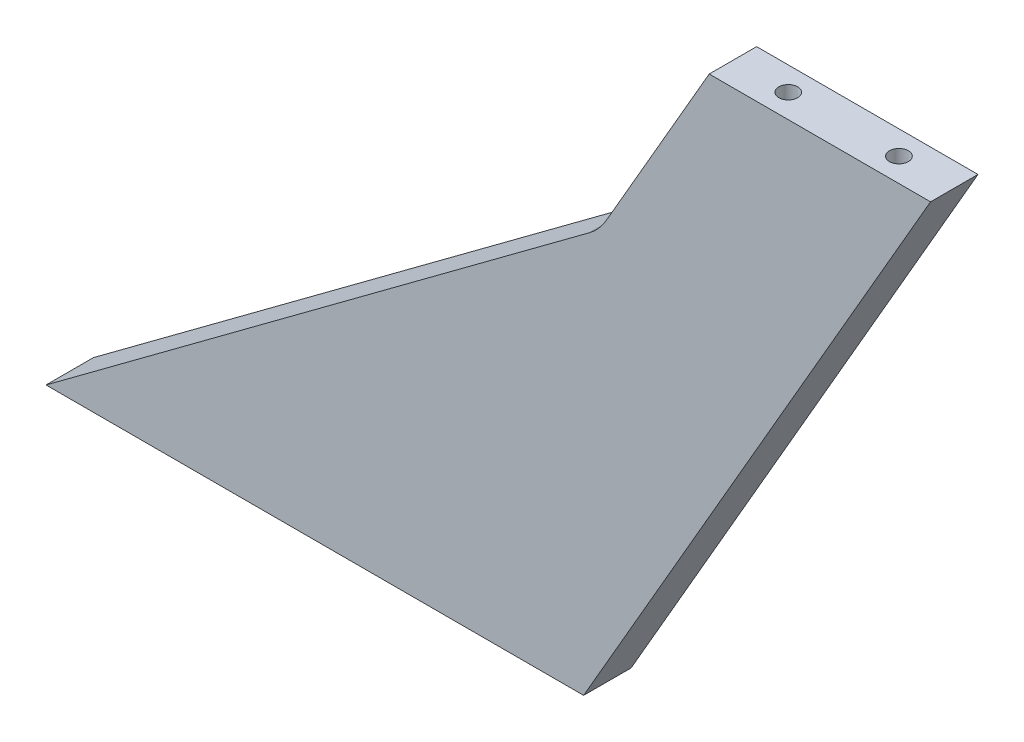
ISO-10303-21;
HEADER;
FILE_DESCRIPTION(('STEP AP214'),'2;1');
FILE_NAME('part.step','',(''),(''),'','','');
FILE_SCHEMA(('AUTOMOTIVE_DESIGN { 1 0 10303 214 1 1 1 1 }'));
ENDSEC;
DATA;
#1=APPLICATION_CONTEXT('core data for automotive mechanical design processes');
#2=APPLICATION_PROTOCOL_DEFINITION('international standard','automotive_design',2000,#1);
#3=PRODUCT_CONTEXT('',#1,'mechanical');
#4=PRODUCT('Part','Part','',(#3));
#5=PRODUCT_RELATED_PRODUCT_CATEGORY('part','',(#4));
#6=PRODUCT_DEFINITION_FORMATION('','',#4);
#7=PRODUCT_DEFINITION_CONTEXT('part definition',#1,'design');
#8=PRODUCT_DEFINITION('design','',#6,#7);
#9=PRODUCT_DEFINITION_SHAPE('','',#8);
#10=(LENGTH_UNIT() NAMED_UNIT(*) SI_UNIT(.MILLI.,.METRE.));
#11=(NAMED_UNIT(*) PLANE_ANGLE_UNIT() SI_UNIT($,.RADIAN.));
#12=(NAMED_UNIT(*) SI_UNIT($,.STERADIAN.) SOLID_ANGLE_UNIT());
#13=UNCERTAINTY_MEASURE_WITH_UNIT(LENGTH_MEASURE(1.E-05),#10,'distance_accuracy_value','');
#14=(GEOMETRIC_REPRESENTATION_CONTEXT(3) GLOBAL_UNCERTAINTY_ASSIGNED_CONTEXT((#13)) GLOBAL_UNIT_ASSIGNED_CONTEXT((#10,
#11,#12)) REPRESENTATION_CONTEXT('',''));
#15=CARTESIAN_POINT('',(0.,0.,0.));
#16=DIRECTION('',(0.,0.,1.));
#17=DIRECTION('',(1.,0.,0.));
#18=AXIS2_PLACEMENT_3D('',#15,#16,#17);
#19=CARTESIAN_POINT('',(0.,0.,0.));
#20=DIRECTION('',(0.,1.,0.));
#21=DIRECTION('',(0.,0.,1.));
#22=AXIS2_PLACEMENT_3D('',#19,#20,#21);
#23=PLANE('',#22);
#24=CARTESIAN_POINT('',(-42.8625,0.,0.));
#25=DIRECTION('',(0.,-1.,0.));
#26=DIRECTION('',(0.,0.,-1.));
#27=AXIS2_PLACEMENT_3D('',#24,#25,#26);
#28=CIRCLE('',#27,1.89864999999999);
#29=CARTESIAN_POINT('',(-42.8625,0.,-1.89864999999999));
#30=VERTEX_POINT('',#29);
#31=EDGE_CURVE('E105',#30,#30,#28,.T.);
#32=ORIENTED_EDGE('',*,*,#31,.F.);
#33=EDGE_LOOP('',(#32));
#34=FACE_BOUND('',#33,.T.);
#35=CARTESIAN_POINT('',(-65.0875,0.,0.));
#36=DIRECTION('',(0.,-1.,0.));
#37=DIRECTION('',(0.,0.,-1.));
#38=AXIS2_PLACEMENT_3D('',#35,#36,#37);
#39=CIRCLE('',#38,1.89864999999999);
#40=CARTESIAN_POINT('',(-65.0875,0.,-1.89864999999999));
#41=VERTEX_POINT('',#40);
#42=EDGE_CURVE('E104',#41,#41,#39,.T.);
#43=ORIENTED_EDGE('',*,*,#42,.F.);
#44=EDGE_LOOP('',(#43));
#45=FACE_BOUND('',#44,.T.);
#46=CARTESIAN_POINT('',(-11.1125,0.,0.));
#47=DIRECTION('',(0.,-1.,0.));
#48=DIRECTION('',(0.,0.,-1.));
#49=AXIS2_PLACEMENT_3D('',#46,#47,#48);
#50=CIRCLE('',#49,1.89865);
#51=CARTESIAN_POINT('',(-11.1125,0.,-1.89865));
#52=VERTEX_POINT('',#51);
#53=EDGE_CURVE('E134',#52,#52,#50,.T.);
#54=ORIENTED_EDGE('',*,*,#53,.F.);
#55=EDGE_LOOP('',(#54));
#56=FACE_BOUND('',#55,.T.);
#57=CARTESIAN_POINT('',(11.1125,0.,0.));
#58=DIRECTION('',(0.,-1.,0.));
#59=DIRECTION('',(0.,0.,-1.));
#60=AXIS2_PLACEMENT_3D('',#57,#58,#59);
#61=CIRCLE('',#60,1.89865);
#62=CARTESIAN_POINT('',(11.1125,0.,-1.89865));
#63=VERTEX_POINT('',#62);
#64=EDGE_CURVE('E140',#63,#63,#61,.T.);
#65=ORIENTED_EDGE('',*,*,#64,.F.);
#66=EDGE_LOOP('',(#65));
#67=FACE_BOUND('',#66,.T.);
#68=DIRECTION('',(1.,0.,0.));
#69=VECTOR('',#68,1.);
#70=CARTESIAN_POINT('',(-22.225,0.,4.7625));
#71=LINE('',#70,#69);
#72=CARTESIAN_POINT('',(-85.725,0.,4.7625));
#73=VERTEX_POINT('',#72);
#74=CARTESIAN_POINT('',(22.225,0.,4.7625));
#75=VERTEX_POINT('',#74);
#76=EDGE_CURVE('E146',#73,#75,#71,.T.);
#77=ORIENTED_EDGE('',*,*,#76,.F.);
#78=DIRECTION('',(0.,0.,1.));
#79=VECTOR('',#78,1.);
#80=CARTESIAN_POINT('',(-85.725,0.,-143.222266549626));
#81=LINE('',#80,#79);
#82=CARTESIAN_POINT('',(-85.725,0.,-4.7625));
#83=VERTEX_POINT('',#82);
#84=EDGE_CURVE('E119',#83,#73,#81,.T.);
#85=ORIENTED_EDGE('',*,*,#84,.F.);
#86=DIRECTION('',(-1.,0.,0.));
#87=VECTOR('',#86,1.);
#88=CARTESIAN_POINT('',(-22.225,0.,-4.7625));
#89=LINE('',#88,#87);
#90=CARTESIAN_POINT('',(22.225,0.,-4.7625));
#91=VERTEX_POINT('',#90);
#92=EDGE_CURVE('E155',#91,#83,#89,.T.);
#93=ORIENTED_EDGE('',*,*,#92,.F.);
#94=DIRECTION('',(0.,0.,-1.));
#95=VECTOR('',#94,1.);
#96=CARTESIAN_POINT('',(22.225,0.,-4.7625));
#97=LINE('',#96,#95);
#98=EDGE_CURVE('E158',#75,#91,#97,.T.);
#99=ORIENTED_EDGE('',*,*,#98,.F.);
#100=EDGE_LOOP('',(#77,#85,#93,#99));
#101=FACE_BOUND('',#100,.T.);
#102=ADVANCED_FACE('F39',(#34,#45,#56,#67,#101),#23,.F.);
#103=CARTESIAN_POINT('',(69.6573099777279,120.65,0.));
#104=DIRECTION('',(0.,1.,0.));
#105=DIRECTION('',(0.,0.,1.));
#106=AXIS2_PLACEMENT_3D('',#103,#104,#105);
#107=PLANE('',#106);
#108=CARTESIAN_POINT('',(58.5448099777279,120.65,0.));
#109=DIRECTION('',(0.,1.,0.));
#110=DIRECTION('',(0.,0.,1.));
#111=AXIS2_PLACEMENT_3D('',#108,#109,#110);
#112=CIRCLE('',#111,1.89864999999999);
#113=CARTESIAN_POINT('',(58.5448099777279,120.65,1.89864999999999));
#114=VERTEX_POINT('',#113);
#115=EDGE_CURVE('E122',#114,#114,#112,.T.);
#116=ORIENTED_EDGE('',*,*,#115,.F.);
#117=EDGE_LOOP('',(#116));
#118=FACE_BOUND('',#117,.T.);
#119=CARTESIAN_POINT('',(80.7698099777279,120.65,0.));
#120=DIRECTION('',(0.,1.,0.));
#121=DIRECTION('',(0.,0.,1.));
#122=AXIS2_PLACEMENT_3D('',#119,#120,#121);
#123=CIRCLE('',#122,1.89864999999999);
#124=CARTESIAN_POINT('',(80.7698099777279,120.65,1.89864999999999));
#125=VERTEX_POINT('',#124);
#126=EDGE_CURVE('E128',#125,#125,#123,.T.);
#127=ORIENTED_EDGE('',*,*,#126,.F.);
#128=EDGE_LOOP('',(#127));
#129=FACE_BOUND('',#128,.T.);
#130=DIRECTION('',(0.,0.,1.));
#131=VECTOR('',#130,1.);
#132=CARTESIAN_POINT('',(47.4323099777279,120.65,-4.7625));
#133=LINE('',#132,#131);
#134=CARTESIAN_POINT('',(47.4323099777279,120.65,-4.7625));
#135=VERTEX_POINT('',#134);
#136=CARTESIAN_POINT('',(47.4323099777279,120.65,4.7625));
#137=VERTEX_POINT('',#136);
#138=EDGE_CURVE('E147',#135,#137,#133,.T.);
#139=ORIENTED_EDGE('',*,*,#138,.T.);
#140=DIRECTION('',(1.,0.,0.));
#141=VECTOR('',#140,1.);
#142=CARTESIAN_POINT('',(47.4323099777279,120.65,4.7625));
#143=LINE('',#142,#141);
#144=CARTESIAN_POINT('',(91.8823099777279,120.65,4.7625));
#145=VERTEX_POINT('',#144);
#146=EDGE_CURVE('E153',#137,#145,#143,.T.);
#147=ORIENTED_EDGE('',*,*,#146,.T.);
#148=DIRECTION('',(0.,0.,-1.));
#149=VECTOR('',#148,1.);
#150=CARTESIAN_POINT('',(91.8823099777279,120.65,-4.7625));
#151=LINE('',#150,#149);
#152=CARTESIAN_POINT('',(91.8823099777279,120.65,-4.7625));
#153=VERTEX_POINT('',#152);
#154=EDGE_CURVE('E163',#145,#153,#151,.T.);
#155=ORIENTED_EDGE('',*,*,#154,.T.);
#156=DIRECTION('',(-1.,0.,0.));
#157=VECTOR('',#156,1.);
#158=CARTESIAN_POINT('',(47.4323099777279,120.65,-4.7625));
#159=LINE('',#158,#157);
#160=EDGE_CURVE('E170',#153,#135,#159,.T.);
#161=ORIENTED_EDGE('',*,*,#160,.T.);
#162=EDGE_LOOP('',(#139,#147,#155,#161));
#163=FACE_BOUND('',#162,.T.);
#164=ADVANCED_FACE('F190',(#118,#129,#163),#107,.T.);
#165=CARTESIAN_POINT('',(-22.225,0.,-4.7625));
#166=DIRECTION('',(-0.86602540378444,0.499999999999998,0.));
#167=DIRECTION('',(-0.499999999999998,-0.86602540378444,0.));
#168=AXIS2_PLACEMENT_3D('',#165,#166,#167);
#169=PLANE('',#168);
#170=DIRECTION('',(0.499999999999998,0.86602540378444,0.));
#171=VECTOR('',#170,1.);
#172=CARTESIAN_POINT('',(-22.225,0.,-4.7625));
#173=LINE('',#172,#171);
#174=CARTESIAN_POINT('',(26.7503805434542,84.8278474212834,-4.7625));
#175=VERTEX_POINT('',#174);
#176=EDGE_CURVE('E151',#175,#135,#173,.T.);
#177=ORIENTED_EDGE('',*,*,#176,.F.);
#178=DIRECTION('',(0.,0.,1.));
#179=VECTOR('',#178,1.);
#180=CARTESIAN_POINT('',(26.7503805434542,84.8278474212835,4.7625));
#181=LINE('',#180,#179);
#182=CARTESIAN_POINT('',(26.7503805434542,84.8278474212834,4.7625));
#183=VERTEX_POINT('',#182);
#184=EDGE_CURVE('E175',#175,#183,#181,.T.);
#185=ORIENTED_EDGE('',*,*,#184,.T.);
#186=DIRECTION('',(0.499999999999998,0.86602540378444,0.));
#187=VECTOR('',#186,1.);
#188=CARTESIAN_POINT('',(-22.225,0.,4.7625));
#189=LINE('',#188,#187);
#190=EDGE_CURVE('E150',#183,#137,#189,.T.);
#191=ORIENTED_EDGE('',*,*,#190,.T.);
#192=ORIENTED_EDGE('',*,*,#138,.F.);
#193=EDGE_LOOP('',(#177,#185,#191,#192));
#194=FACE_BOUND('',#193,.T.);
#195=ADVANCED_FACE('F181',(#194),#169,.T.);
#196=CARTESIAN_POINT('',(-22.225,0.,4.7625));
#197=DIRECTION('',(0.,0.,1.));
#198=DIRECTION('',(1.,0.,0.));
#199=AXIS2_PLACEMENT_3D('',#196,#197,#198);
#200=PLANE('',#199);
#201=DIRECTION('',(0.499999999999998,0.86602540378444,0.));
#202=VECTOR('',#201,1.);
#203=CARTESIAN_POINT('',(22.225,0.,4.7625));
#204=LINE('',#203,#202);
#205=EDGE_CURVE('E160',#75,#145,#204,.T.);
#206=ORIENTED_EDGE('',*,*,#205,.T.);
#207=ORIENTED_EDGE('',*,*,#146,.F.);
#208=ORIENTED_EDGE('',*,*,#190,.F.);
#209=CARTESIAN_POINT('',(15.7518579153918,91.1778474212834,4.7625));
#210=DIRECTION('',(0.,0.,1.));
#211=DIRECTION('',(1.,0.,0.));
#212=AXIS2_PLACEMENT_3D('',#209,#210,#211);
#213=CIRCLE('',#212,12.7);
#214=CARTESIAN_POINT('',(23.3236242568022,80.9818504385905,4.7625));
#215=VERTEX_POINT('',#214);
#216=EDGE_CURVE('E47',#183,#215,#213,.F.);
#217=ORIENTED_EDGE('',*,*,#216,.T.);
#218=DIRECTION('',(-0.802834408086063,-0.596202074126802,0.));
#219=VECTOR('',#218,1.);
#220=CARTESIAN_POINT('',(-85.725,0.,4.7625));
#221=LINE('',#220,#219);
#222=EDGE_CURVE('E115',#215,#73,#221,.T.);
#223=ORIENTED_EDGE('',*,*,#222,.T.);
#224=ORIENTED_EDGE('',*,*,#76,.T.);
#225=EDGE_LOOP('',(#206,#207,#208,#217,#223,#224));
#226=FACE_BOUND('',#225,.T.);
#227=ADVANCED_FACE('F186',(#226),#200,.T.);
#228=CARTESIAN_POINT('',(22.225,0.,-4.7625));
#229=DIRECTION('',(0.86602540378444,-0.499999999999998,0.));
#230=DIRECTION('',(0.499999999999998,0.86602540378444,0.));
#231=AXIS2_PLACEMENT_3D('',#228,#229,#230);
#232=PLANE('',#231);
#233=DIRECTION('',(0.499999999999998,0.86602540378444,0.));
#234=VECTOR('',#233,1.);
#235=CARTESIAN_POINT('',(22.225,0.,-4.7625));
#236=LINE('',#235,#234);
#237=EDGE_CURVE('E167',#91,#153,#236,.T.);
#238=ORIENTED_EDGE('',*,*,#237,.T.);
#239=ORIENTED_EDGE('',*,*,#154,.F.);
#240=ORIENTED_EDGE('',*,*,#205,.F.);
#241=ORIENTED_EDGE('',*,*,#98,.T.);
#242=EDGE_LOOP('',(#238,#239,#240,#241));
#243=FACE_BOUND('',#242,.T.);
#244=ADVANCED_FACE('F193',(#243),#232,.T.);
#245=CARTESIAN_POINT('',(-22.225,0.,-4.7625));
#246=DIRECTION('',(0.,0.,-1.));
#247=DIRECTION('',(-1.,0.,0.));
#248=AXIS2_PLACEMENT_3D('',#245,#246,#247);
#249=PLANE('',#248);
#250=ORIENTED_EDGE('',*,*,#160,.F.);
#251=ORIENTED_EDGE('',*,*,#237,.F.);
#252=ORIENTED_EDGE('',*,*,#92,.T.);
#253=DIRECTION('',(-0.802834408086063,-0.596202074126802,0.));
#254=VECTOR('',#253,1.);
#255=CARTESIAN_POINT('',(-85.725,0.,-4.7625));
#256=LINE('',#255,#254);
#257=CARTESIAN_POINT('',(23.3236242568023,80.9818504385905,-4.7625));
#258=VERTEX_POINT('',#257);
#259=EDGE_CURVE('E117',#258,#83,#256,.T.);
#260=ORIENTED_EDGE('',*,*,#259,.F.);
#261=CARTESIAN_POINT('',(15.7518579153918,91.1778474212834,-4.7625));
#262=DIRECTION('',(0.,0.,-1.));
#263=DIRECTION('',(-1.,0.,0.));
#264=AXIS2_PLACEMENT_3D('',#261,#262,#263);
#265=CIRCLE('',#264,12.7);
#266=EDGE_CURVE('E11',#258,#175,#265,.F.);
#267=ORIENTED_EDGE('',*,*,#266,.T.);
#268=ORIENTED_EDGE('',*,*,#176,.T.);
#269=EDGE_LOOP('',(#250,#251,#252,#260,#267,#268));
#270=FACE_BOUND('',#269,.T.);
#271=ADVANCED_FACE('F196',(#270),#249,.T.);
#272=CARTESIAN_POINT('',(11.1125,12.954,0.));
#273=DIRECTION('',(0.,1.,0.));
#274=DIRECTION('',(0.,0.,1.));
#275=AXIS2_PLACEMENT_3D('',#272,#273,#274);
#276=PLANE('',#275);
#277=CARTESIAN_POINT('',(11.1125,12.954,0.));
#278=DIRECTION('',(0.,-1.,0.));
#279=DIRECTION('',(0.,0.,-1.));
#280=AXIS2_PLACEMENT_3D('',#277,#278,#279);
#281=CIRCLE('',#280,1.89865);
#282=CARTESIAN_POINT('',(11.1125,12.954,-1.89864999999999));
#283=VERTEX_POINT('',#282);
#284=EDGE_CURVE('E143',#283,#283,#281,.T.);
#285=ORIENTED_EDGE('',*,*,#284,.T.);
#286=EDGE_LOOP('',(#285));
#287=FACE_BOUND('',#286,.T.);
#288=ADVANCED_FACE('F204',(#287),#276,.F.);
#289=CARTESIAN_POINT('',(11.1125,0.,0.));
#290=DIRECTION('',(0.,-1.,0.));
#291=DIRECTION('',(0.,0.,-1.));
#292=AXIS2_PLACEMENT_3D('',#289,#290,#291);
#293=CYLINDRICAL_SURFACE('',#292,1.89865);
#294=ORIENTED_EDGE('',*,*,#284,.F.);
#295=EDGE_LOOP('',(#294));
#296=FACE_BOUND('',#295,.T.);
#297=ORIENTED_EDGE('',*,*,#64,.T.);
#298=EDGE_LOOP('',(#297));
#299=FACE_BOUND('',#298,.T.);
#300=ADVANCED_FACE('F210',(#296,#299),#293,.F.);
#301=CARTESIAN_POINT('',(-11.1125,12.954,0.));
#302=DIRECTION('',(0.,1.,0.));
#303=DIRECTION('',(0.,0.,1.));
#304=AXIS2_PLACEMENT_3D('',#301,#302,#303);
#305=PLANE('',#304);
#306=CARTESIAN_POINT('',(-11.1125,12.954,0.));
#307=DIRECTION('',(0.,-1.,0.));
#308=DIRECTION('',(0.,0.,-1.));
#309=AXIS2_PLACEMENT_3D('',#306,#307,#308);
#310=CIRCLE('',#309,1.89865);
#311=CARTESIAN_POINT('',(-11.1125,12.954,-1.89865));
#312=VERTEX_POINT('',#311);
#313=EDGE_CURVE('E137',#312,#312,#310,.T.);
#314=ORIENTED_EDGE('',*,*,#313,.T.);
#315=EDGE_LOOP('',(#314));
#316=FACE_BOUND('',#315,.T.);
#317=ADVANCED_FACE('F261',(#316),#305,.F.);
#318=CARTESIAN_POINT('',(-11.1125,0.,0.));
#319=DIRECTION('',(0.,-1.,0.));
#320=DIRECTION('',(0.,0.,-1.));
#321=AXIS2_PLACEMENT_3D('',#318,#319,#320);
#322=CYLINDRICAL_SURFACE('',#321,1.89865);
#323=ORIENTED_EDGE('',*,*,#313,.F.);
#324=EDGE_LOOP('',(#323));
#325=FACE_BOUND('',#324,.T.);
#326=ORIENTED_EDGE('',*,*,#53,.T.);
#327=EDGE_LOOP('',(#326));
#328=FACE_BOUND('',#327,.T.);
#329=ADVANCED_FACE('F257',(#325,#328),#322,.F.);
#330=CARTESIAN_POINT('',(80.7698099777279,110.998,0.));
#331=DIRECTION('',(0.,-1.,0.));
#332=DIRECTION('',(0.,0.,-1.));
#333=AXIS2_PLACEMENT_3D('',#330,#331,#332);
#334=PLANE('',#333);
#335=CARTESIAN_POINT('',(80.7698099777279,110.998,0.));
#336=DIRECTION('',(0.,1.,0.));
#337=DIRECTION('',(0.,0.,1.));
#338=AXIS2_PLACEMENT_3D('',#335,#336,#337);
#339=CIRCLE('',#338,1.89865);
#340=CARTESIAN_POINT('',(80.7698099777279,110.998,1.89865));
#341=VERTEX_POINT('',#340);
#342=EDGE_CURVE('E131',#341,#341,#339,.T.);
#343=ORIENTED_EDGE('',*,*,#342,.T.);
#344=EDGE_LOOP('',(#343));
#345=FACE_BOUND('',#344,.T.);
#346=ADVANCED_FACE('F253',(#345),#334,.F.);
#347=CARTESIAN_POINT('',(80.7698099777279,120.65,0.));
#348=DIRECTION('',(0.,1.,0.));
#349=DIRECTION('',(0.,0.,1.));
#350=AXIS2_PLACEMENT_3D('',#347,#348,#349);
#351=CYLINDRICAL_SURFACE('',#350,1.89864999999999);
#352=ORIENTED_EDGE('',*,*,#342,.F.);
#353=EDGE_LOOP('',(#352));
#354=FACE_BOUND('',#353,.T.);
#355=ORIENTED_EDGE('',*,*,#126,.T.);
#356=EDGE_LOOP('',(#355));
#357=FACE_BOUND('',#356,.T.);
#358=ADVANCED_FACE('F249',(#354,#357),#351,.F.);
#359=CARTESIAN_POINT('',(58.5448099777279,110.998,0.));
#360=DIRECTION('',(0.,-1.,0.));
#361=DIRECTION('',(0.,0.,-1.));
#362=AXIS2_PLACEMENT_3D('',#359,#360,#361);
#363=PLANE('',#362);
#364=CARTESIAN_POINT('',(58.5448099777279,110.998,0.));
#365=DIRECTION('',(0.,1.,0.));
#366=DIRECTION('',(0.,0.,1.));
#367=AXIS2_PLACEMENT_3D('',#364,#365,#366);
#368=CIRCLE('',#367,1.89864999999999);
#369=CARTESIAN_POINT('',(58.5448099777279,110.998,1.89864999999999));
#370=VERTEX_POINT('',#369);
#371=EDGE_CURVE('E125',#370,#370,#368,.T.);
#372=ORIENTED_EDGE('',*,*,#371,.T.);
#373=EDGE_LOOP('',(#372));
#374=FACE_BOUND('',#373,.T.);
#375=ADVANCED_FACE('F242',(#374),#363,.F.);
#376=CARTESIAN_POINT('',(58.5448099777279,120.65,0.));
#377=DIRECTION('',(0.,1.,0.));
#378=DIRECTION('',(0.,0.,1.));
#379=AXIS2_PLACEMENT_3D('',#376,#377,#378);
#380=CYLINDRICAL_SURFACE('',#379,1.89864999999999);
#381=ORIENTED_EDGE('',*,*,#371,.F.);
#382=EDGE_LOOP('',(#381));
#383=FACE_BOUND('',#382,.T.);
#384=ORIENTED_EDGE('',*,*,#115,.T.);
#385=EDGE_LOOP('',(#384));
#386=FACE_BOUND('',#385,.T.);
#387=ADVANCED_FACE('F234',(#383,#386),#380,.F.);
#388=CARTESIAN_POINT('',(-85.725,0.,-143.222266549626));
#389=DIRECTION('',(-0.596202074126802,0.802834408086063,0.));
#390=DIRECTION('',(-0.802834408086063,-0.596202074126802,0.));
#391=AXIS2_PLACEMENT_3D('',#388,#389,#390);
#392=PLANE('',#391);
#393=ORIENTED_EDGE('',*,*,#222,.F.);
#394=DIRECTION('',(0.,0.,1.));
#395=VECTOR('',#394,1.);
#396=CARTESIAN_POINT('',(23.3236242568022,80.9818504385904,-4.7625));
#397=LINE('',#396,#395);
#398=EDGE_CURVE('E60',#215,#258,#397,.F.);
#399=ORIENTED_EDGE('',*,*,#398,.T.);
#400=ORIENTED_EDGE('',*,*,#259,.T.);
#401=ORIENTED_EDGE('',*,*,#84,.T.);
#402=EDGE_LOOP('',(#393,#399,#400,#401));
#403=FACE_BOUND('',#402,.T.);
#404=ADVANCED_FACE('F231',(#403),#392,.T.);
#405=CARTESIAN_POINT('',(-65.0875,12.954,0.));
#406=DIRECTION('',(0.,-1.,0.));
#407=DIRECTION('',(0.,0.,-1.));
#408=AXIS2_PLACEMENT_3D('',#405,#406,#407);
#409=CONICAL_SURFACE('',#408,1.89864999999999,1.02974425867665);
#410=CARTESIAN_POINT('',(-65.0875,14.0948240143167,0.));
#411=VERTEX_POINT('',#410);
#412=VERTEX_LOOP('',#411);
#413=FACE_BOUND('',#412,.T.);
#414=CARTESIAN_POINT('',(-65.0875,12.954,0.));
#415=DIRECTION('',(0.,-1.,0.));
#416=DIRECTION('',(0.,0.,-1.));
#417=AXIS2_PLACEMENT_3D('',#414,#415,#416);
#418=CIRCLE('',#417,1.89864999999999);
#419=CARTESIAN_POINT('',(-65.0875,12.954,-1.89864999999999));
#420=VERTEX_POINT('',#419);
#421=EDGE_CURVE('E108',#420,#420,#418,.T.);
#422=ORIENTED_EDGE('',*,*,#421,.T.);
#423=EDGE_LOOP('',(#422));
#424=FACE_BOUND('',#423,.T.);
#425=ADVANCED_FACE('F233',(#413,#424),#409,.F.);
#426=CARTESIAN_POINT('',(-65.0875,0.,0.));
#427=DIRECTION('',(0.,-1.,0.));
#428=DIRECTION('',(0.,0.,-1.));
#429=AXIS2_PLACEMENT_3D('',#426,#427,#428);
#430=CYLINDRICAL_SURFACE('',#429,1.89864999999999);
#431=ORIENTED_EDGE('',*,*,#421,.F.);
#432=EDGE_LOOP('',(#431));
#433=FACE_BOUND('',#432,.T.);
#434=ORIENTED_EDGE('',*,*,#42,.T.);
#435=EDGE_LOOP('',(#434));
#436=FACE_BOUND('',#435,.T.);
#437=ADVANCED_FACE('F98',(#433,#436),#430,.F.);
#438=CARTESIAN_POINT('',(-42.8625,12.954,0.));
#439=DIRECTION('',(0.,-1.,0.));
#440=DIRECTION('',(0.,0.,-1.));
#441=AXIS2_PLACEMENT_3D('',#438,#439,#440);
#442=CONICAL_SURFACE('',#441,1.89864999999999,1.02974425867665);
#443=CARTESIAN_POINT('',(-42.8625,14.0948240143167,0.));
#444=VERTEX_POINT('',#443);
#445=VERTEX_LOOP('',#444);
#446=FACE_BOUND('',#445,.T.);
#447=CARTESIAN_POINT('',(-42.8625,12.954,0.));
#448=DIRECTION('',(0.,-1.,0.));
#449=DIRECTION('',(0.,0.,-1.));
#450=AXIS2_PLACEMENT_3D('',#447,#448,#449);
#451=CIRCLE('',#450,1.89864999999999);
#452=CARTESIAN_POINT('',(-42.8625,12.954,-1.89864999999999));
#453=VERTEX_POINT('',#452);
#454=EDGE_CURVE('E102',#453,#453,#451,.T.);
#455=ORIENTED_EDGE('',*,*,#454,.T.);
#456=EDGE_LOOP('',(#455));
#457=FACE_BOUND('',#456,.T.);
#458=ADVANCED_FACE('F94',(#446,#457),#442,.F.);
#459=CARTESIAN_POINT('',(-42.8625,0.,0.));
#460=DIRECTION('',(0.,-1.,0.));
#461=DIRECTION('',(0.,0.,-1.));
#462=AXIS2_PLACEMENT_3D('',#459,#460,#461);
#463=CYLINDRICAL_SURFACE('',#462,1.89864999999999);
#464=ORIENTED_EDGE('',*,*,#454,.F.);
#465=EDGE_LOOP('',(#464));
#466=FACE_BOUND('',#465,.T.);
#467=ORIENTED_EDGE('',*,*,#31,.T.);
#468=EDGE_LOOP('',(#467));
#469=FACE_BOUND('',#468,.T.);
#470=ADVANCED_FACE('F97',(#466,#469),#463,.F.);
#471=CARTESIAN_POINT('',(15.7518579153918,91.1778474212834,-4.7625));
#472=DIRECTION('',(0.,0.,-1.));
#473=DIRECTION('',(-1.,0.,0.));
#474=AXIS2_PLACEMENT_3D('',#471,#472,#473);
#475=CYLINDRICAL_SURFACE('',#474,12.7);
#476=ORIENTED_EDGE('',*,*,#266,.F.);
#477=ORIENTED_EDGE('',*,*,#398,.F.);
#478=ORIENTED_EDGE('',*,*,#216,.F.);
#479=ORIENTED_EDGE('',*,*,#184,.F.);
#480=EDGE_LOOP('',(#476,#477,#478,#479));
#481=FACE_BOUND('',#480,.T.);
#482=ADVANCED_FACE('F41',(#481),#475,.F.);
#483=CLOSED_SHELL('',(#102,#164,#195,#227,#244,#271,#288,#300,#317,#329,#346,#358,#375,#387,
#404,#425,#437,#458,#470,#482));
#484=MANIFOLD_SOLID_BREP('B2',#483);
#485=ADVANCED_BREP_SHAPE_REPRESENTATION('',(#18,#484),#14);
#486=SHAPE_DEFINITION_REPRESENTATION(#9,#485);
ENDSEC;
END-ISO-10303-21;
